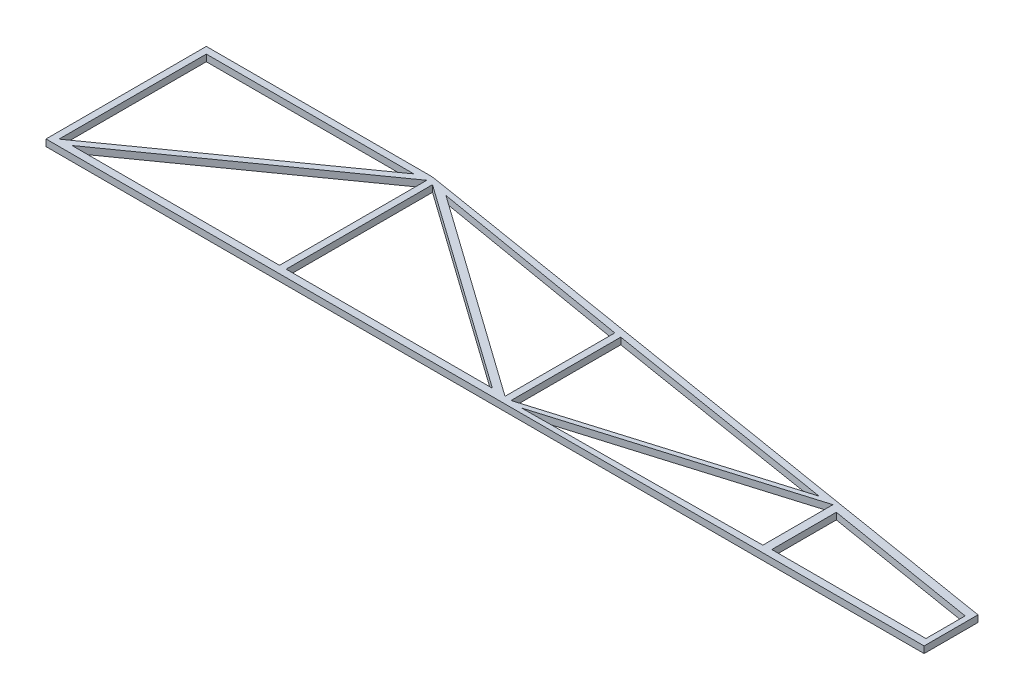
ISO-10303-21;
HEADER;
FILE_DESCRIPTION(('STEP AP214'),'2;1');
FILE_NAME('part.step','',(''),(''),'','','');
FILE_SCHEMA(('AUTOMOTIVE_DESIGN { 1 0 10303 214 1 1 1 1 }'));
ENDSEC;
DATA;
#1=APPLICATION_CONTEXT('core data for automotive mechanical design processes');
#2=APPLICATION_PROTOCOL_DEFINITION('international standard','automotive_design',2000,#1);
#3=PRODUCT_CONTEXT('',#1,'mechanical');
#4=PRODUCT('Part','Part','',(#3));
#5=PRODUCT_RELATED_PRODUCT_CATEGORY('part','',(#4));
#6=PRODUCT_DEFINITION_FORMATION('','',#4);
#7=PRODUCT_DEFINITION_CONTEXT('part definition',#1,'design');
#8=PRODUCT_DEFINITION('design','',#6,#7);
#9=PRODUCT_DEFINITION_SHAPE('','',#8);
#10=(LENGTH_UNIT() NAMED_UNIT(*) SI_UNIT(.MILLI.,.METRE.));
#11=(NAMED_UNIT(*) PLANE_ANGLE_UNIT() SI_UNIT($,.RADIAN.));
#12=(NAMED_UNIT(*) SI_UNIT($,.STERADIAN.) SOLID_ANGLE_UNIT());
#13=UNCERTAINTY_MEASURE_WITH_UNIT(LENGTH_MEASURE(1.E-05),#10,'distance_accuracy_value','');
#14=(GEOMETRIC_REPRESENTATION_CONTEXT(3) GLOBAL_UNCERTAINTY_ASSIGNED_CONTEXT((#13)) GLOBAL_UNIT_ASSIGNED_CONTEXT((#10,
#11,#12)) REPRESENTATION_CONTEXT('',''));
#15=CARTESIAN_POINT('',(0.,0.,0.));
#16=DIRECTION('',(0.,0.,1.));
#17=DIRECTION('',(1.,0.,0.));
#18=AXIS2_PLACEMENT_3D('',#15,#16,#17);
#19=CARTESIAN_POINT('',(0.,-6.35,0.));
#20=DIRECTION('',(0.,-1.,0.));
#21=DIRECTION('',(0.,0.,-1.));
#22=AXIS2_PLACEMENT_3D('',#19,#20,#21);
#23=PLANE('',#22);
#24=DIRECTION('',(0.,0.,-1.));
#25=VECTOR('',#24,1.);
#26=CARTESIAN_POINT('',(161.624236277358,-6.35,134.776122622587));
#27=LINE('',#26,#25);
#28=CARTESIAN_POINT('',(161.624236277358,-6.35,135.411122622587));
#29=VERTEX_POINT('',#28);
#30=CARTESIAN_POINT('',(161.624236277358,-6.35,-5.81236784555289));
#31=VERTEX_POINT('',#30);
#32=EDGE_CURVE('E302',#29,#31,#27,.T.);
#33=ORIENTED_EDGE('',*,*,#32,.T.);
#34=DIRECTION('',(-0.815532011604098,0.,0.578711964667202));
#35=VECTOR('',#34,1.);
#36=CARTESIAN_POINT('',(161.624236277358,-6.35,-5.81236784555289));
#37=LINE('',#36,#35);
#38=CARTESIAN_POINT('',(-37.3906179143402,-6.35,135.411122622587));
#39=VERTEX_POINT('',#38);
#40=EDGE_CURVE('E301',#31,#39,#37,.T.);
#41=ORIENTED_EDGE('',*,*,#40,.T.);
#42=DIRECTION('',(1.,0.,0.));
#43=VECTOR('',#42,1.);
#44=CARTESIAN_POINT('',(0.,-6.35,135.411122622587));
#45=LINE('',#44,#43);
#46=EDGE_CURVE('E307',#39,#29,#45,.T.);
#47=ORIENTED_EDGE('',*,*,#46,.T.);
#48=EDGE_LOOP('',(#33,#41,#47));
#49=FACE_BOUND('',#48,.T.);
#50=DIRECTION('',(1.,0.,0.));
#51=VECTOR('',#50,1.);
#52=CARTESIAN_POINT('',(-54.2757637226416,-6.35,-11.2738773774126));
#53=LINE('',#52,#51);
#54=CARTESIAN_POINT('',(-54.2757637226416,-6.35,-11.2738773774126));
#55=VERTEX_POINT('',#54);
#56=CARTESIAN_POINT('',(159.564403118567,-6.35,-11.2738773774126));
#57=VERTEX_POINT('',#56);
#58=EDGE_CURVE('E314',#55,#57,#53,.T.);
#59=ORIENTED_EDGE('',*,*,#58,.T.);
#60=CARTESIAN_POINT('',(159.564403118567,-6.35,14.1261226225874));
#61=DIRECTION('',(0.,-1.,0.));
#62=DIRECTION('',(0.,0.,-1.));
#63=AXIS2_PLACEMENT_3D('',#60,#61,#62);
#64=CIRCLE('',#63,25.4);
#65=CARTESIAN_POINT('',(163.657153350682,-6.35,-10.9419725491149));
#66=VERTEX_POINT('',#65);
#67=EDGE_CURVE('E349',#57,#66,#64,.T.);
#68=ORIENTED_EDGE('',*,*,#67,.T.);
#69=DIRECTION('',(0.986932880775682,0.,0.161131898902152));
#70=VECTOR('',#69,1.);
#71=CARTESIAN_POINT('',(161.624236277358,-6.35,-11.2738773774126));
#72=LINE('',#71,#70);
#73=CARTESIAN_POINT('',(783.924236277358,-6.35,90.3261226225874));
#74=VERTEX_POINT('',#73);
#75=EDGE_CURVE('E317',#66,#74,#72,.T.);
#76=ORIENTED_EDGE('',*,*,#75,.T.);
#77=DIRECTION('',(0.,0.,1.));
#78=VECTOR('',#77,1.);
#79=CARTESIAN_POINT('',(783.924236277358,-6.35,141.126122622587));
#80=LINE('',#79,#78);
#81=CARTESIAN_POINT('',(783.924236277358,-6.35,141.761122622587));
#82=VERTEX_POINT('',#81);
#83=EDGE_CURVE('E320',#74,#82,#80,.T.);
#84=ORIENTED_EDGE('',*,*,#83,.T.);
#85=DIRECTION('',(-1.,0.,0.));
#86=VECTOR('',#85,1.);
#87=CARTESIAN_POINT('',(-54.2757637226416,-6.35,141.761122622587));
#88=LINE('',#87,#86);
#89=CARTESIAN_POINT('',(-54.2757637226416,-6.35,141.761122622587));
#90=VERTEX_POINT('',#89);
#91=EDGE_CURVE('E322',#82,#90,#88,.T.);
#92=ORIENTED_EDGE('',*,*,#91,.T.);
#93=DIRECTION('',(0.,0.,-1.));
#94=VECTOR('',#93,1.);
#95=CARTESIAN_POINT('',(-54.2757637226416,-6.35,-11.2738773774126));
#96=LINE('',#95,#94);
#97=EDGE_CURVE('E318',#90,#55,#96,.T.);
#98=ORIENTED_EDGE('',*,*,#97,.T.);
#99=EDGE_LOOP('',(#59,#68,#76,#84,#92,#98));
#100=FACE_BOUND('',#99,.T.);
#101=DIRECTION('',(0.,0.,-1.));
#102=VECTOR('',#101,1.);
#103=CARTESIAN_POINT('',(-47.9257637226416,-6.35,135.677412945168));
#104=LINE('',#103,#102);
#105=CARTESIAN_POINT('',(-47.9257637226416,-6.35,135.677412945168));
#106=VERTEX_POINT('',#105);
#107=CARTESIAN_POINT('',(-47.9257637226416,-6.35,-4.92387737741257));
#108=VERTEX_POINT('',#107);
#109=EDGE_CURVE('E283',#106,#108,#104,.T.);
#110=ORIENTED_EDGE('',*,*,#109,.F.);
#111=DIRECTION('',(-0.815507144735218,0.,0.578747005941122));
#112=VECTOR('',#111,1.);
#113=CARTESIAN_POINT('',(150.194236277358,-6.35,-4.92387737741258));
#114=LINE('',#113,#112);
#115=CARTESIAN_POINT('',(150.194236277358,-6.35,-4.92387737741259));
#116=VERTEX_POINT('',#115);
#117=EDGE_CURVE('E287',#116,#106,#114,.T.);
#118=ORIENTED_EDGE('',*,*,#117,.F.);
#119=DIRECTION('',(1.,0.,0.));
#120=VECTOR('',#119,1.);
#121=CARTESIAN_POINT('',(-47.9257637226416,-6.35,-4.92387737741257));
#122=LINE('',#121,#120);
#123=EDGE_CURVE('E284',#108,#116,#122,.T.);
#124=ORIENTED_EDGE('',*,*,#123,.F.);
#125=EDGE_LOOP('',(#110,#118,#124));
#126=FACE_BOUND('',#125,.T.);
#127=DIRECTION('',(0.,0.,1.));
#128=VECTOR('',#127,1.);
#129=CARTESIAN_POINT('',(377.524236277358,-6.35,135.411122622587));
#130=LINE('',#129,#128);
#131=CARTESIAN_POINT('',(377.524236277358,-6.35,30.6361226225874));
#132=VERTEX_POINT('',#131);
#133=CARTESIAN_POINT('',(377.524236277358,-6.35,135.411122622587));
#134=VERTEX_POINT('',#133);
#135=EDGE_CURVE('E269',#132,#134,#130,.T.);
#136=ORIENTED_EDGE('',*,*,#135,.F.);
#137=DIRECTION('',(0.98584155790816,0.,0.167679523798265));
#138=VECTOR('',#137,1.);
#139=CARTESIAN_POINT('',(183.325676014133,-6.35,-2.39466396379012));
#140=LINE('',#139,#138);
#141=CARTESIAN_POINT('',(183.325676014133,-6.35,-2.39466396379012));
#142=VERTEX_POINT('',#141);
#143=EDGE_CURVE('E268',#142,#132,#140,.T.);
#144=ORIENTED_EDGE('',*,*,#143,.F.);
#145=DIRECTION('',(-0.815532011604098,0.,-0.578711964667202));
#146=VECTOR('',#145,1.);
#147=CARTESIAN_POINT('',(377.524236277358,-6.35,135.411122622587));
#148=LINE('',#147,#146);
#149=EDGE_CURVE('E265',#134,#142,#148,.T.);
#150=ORIENTED_EDGE('',*,*,#149,.F.);
#151=EDGE_LOOP('',(#136,#144,#150));
#152=FACE_BOUND('',#151,.T.);
#153=DIRECTION('',(0.,0.,1.));
#154=VECTOR('',#153,1.);
#155=CARTESIAN_POINT('',(167.974236277358,-6.35,134.776122622587));
#156=LINE('',#155,#154);
#157=CARTESIAN_POINT('',(167.974236277358,-6.35,-4.92387737741257));
#158=VERTEX_POINT('',#157);
#159=CARTESIAN_POINT('',(167.974236277358,-6.35,135.411122622587));
#160=VERTEX_POINT('',#159);
#161=EDGE_CURVE('E256',#158,#160,#156,.T.);
#162=ORIENTED_EDGE('',*,*,#161,.T.);
#163=DIRECTION('',(1.,0.,0.));
#164=VECTOR('',#163,1.);
#165=CARTESIAN_POINT('',(0.,-6.35,135.411122622587));
#166=LINE('',#165,#164);
#167=CARTESIAN_POINT('',(365.719009004631,-6.35,135.411122622587));
#168=VERTEX_POINT('',#167);
#169=EDGE_CURVE('E257',#160,#168,#166,.T.);
#170=ORIENTED_EDGE('',*,*,#169,.T.);
#171=DIRECTION('',(-0.815507144735217,0.,-0.578747005941122));
#172=VECTOR('',#171,1.);
#173=CARTESIAN_POINT('',(364.824236277358,-6.35,134.776122622587));
#174=LINE('',#173,#172);
#175=EDGE_CURVE('E252',#168,#158,#174,.T.);
#176=ORIENTED_EDGE('',*,*,#175,.T.);
#177=EDGE_LOOP('',(#162,#170,#176));
#178=FACE_BOUND('',#177,.T.);
#179=DIRECTION('',(-1.,0.,0.));
#180=VECTOR('',#179,1.);
#181=CARTESIAN_POINT('',(0.,-6.35,135.411122622587));
#182=LINE('',#181,#180);
#183=CARTESIAN_POINT('',(778.67236537485,-6.35,135.411122622587));
#184=VERTEX_POINT('',#183);
#185=CARTESIAN_POINT('',(631.524236277358,-6.35,135.411122622587));
#186=VERTEX_POINT('',#185);
#187=EDGE_CURVE('E241',#184,#186,#182,.T.);
#188=ORIENTED_EDGE('',*,*,#187,.F.);
#189=DIRECTION('',(0.,0.,1.));
#190=VECTOR('',#189,1.);
#191=CARTESIAN_POINT('',(778.67236537485,-6.35,134.776122622587));
#192=LINE('',#191,#190);
#193=CARTESIAN_POINT('',(778.67236537485,-6.35,97.3493576564751));
#194=VERTEX_POINT('',#193);
#195=EDGE_CURVE('E247',#194,#184,#192,.T.);
#196=ORIENTED_EDGE('',*,*,#195,.F.);
#197=DIRECTION('',(0.986778811606319,0.,0.16207275207394));
#198=VECTOR('',#197,1.);
#199=CARTESIAN_POINT('',(631.422680754228,-6.35,73.1644427112147));
#200=LINE('',#199,#198);
#201=CARTESIAN_POINT('',(631.524236277358,-6.35,73.1811226225874));
#202=VERTEX_POINT('',#201);
#203=EDGE_CURVE('E246',#202,#194,#200,.T.);
#204=ORIENTED_EDGE('',*,*,#203,.F.);
#205=DIRECTION('',(0.,0.,-1.));
#206=VECTOR('',#205,1.);
#207=CARTESIAN_POINT('',(631.524236277358,-6.35,134.776122622587));
#208=LINE('',#207,#206);
#209=EDGE_CURVE('E242',#186,#202,#208,.T.);
#210=ORIENTED_EDGE('',*,*,#209,.F.);
#211=EDGE_LOOP('',(#188,#196,#204,#210));
#212=FACE_BOUND('',#211,.T.);
#213=DIRECTION('',(0.,0.,-1.));
#214=VECTOR('',#213,1.);
#215=CARTESIAN_POINT('',(383.874236277358,-6.35,136.046122622587));
#216=LINE('',#215,#214);
#217=CARTESIAN_POINT('',(383.874236277358,-6.35,136.046122622587));
#218=VERTEX_POINT('',#217);
#219=CARTESIAN_POINT('',(383.874236277358,-6.35,31.2711226225874));
#220=VERTEX_POINT('',#219);
#221=EDGE_CURVE('E205',#218,#220,#216,.T.);
#222=ORIENTED_EDGE('',*,*,#221,.F.);
#223=DIRECTION('',(-0.957684417737405,0.,0.287820353732961));
#224=VECTOR('',#223,1.);
#225=CARTESIAN_POINT('',(610.04305664974,-6.35,68.0738462888665));
#226=LINE('',#225,#224);
#227=CARTESIAN_POINT('',(610.04305664974,-6.35,68.0738462888664));
#228=VERTEX_POINT('',#227);
#229=EDGE_CURVE('E228',#228,#218,#226,.T.);
#230=ORIENTED_EDGE('',*,*,#229,.F.);
#231=DIRECTION('',(0.987017964959984,0.,0.160609890250421));
#232=VECTOR('',#231,1.);
#233=CARTESIAN_POINT('',(383.874236277358,-6.35,31.2711226225874));
#234=LINE('',#233,#232);
#235=EDGE_CURVE('E225',#220,#228,#234,.T.);
#236=ORIENTED_EDGE('',*,*,#235,.F.);
#237=EDGE_LOOP('',(#222,#230,#236));
#238=FACE_BOUND('',#237,.T.);
#239=DIRECTION('',(-0.957671901939607,0.,0.28786199512158));
#240=VECTOR('',#239,1.);
#241=CARTESIAN_POINT('',(395.04542805939,-6.35,137.199185753966));
#242=LINE('',#241,#240);
#243=CARTESIAN_POINT('',(623.638435017691,-6.35,68.4875122459676));
#244=VERTEX_POINT('',#243);
#245=CARTESIAN_POINT('',(395.04542805939,-6.35,137.199185753966));
#246=VERTEX_POINT('',#245);
#247=EDGE_CURVE('E213',#244,#246,#242,.T.);
#248=ORIENTED_EDGE('',*,*,#247,.T.);
#249=DIRECTION('',(0.999969409266412,0.,-0.00782179847497131));
#250=VECTOR('',#249,1.);
#251=CARTESIAN_POINT('',(623.638435017691,-6.35,135.411122622587));
#252=LINE('',#251,#250);
#253=CARTESIAN_POINT('',(623.638435017691,-6.35,135.411122622587));
#254=VERTEX_POINT('',#253);
#255=EDGE_CURVE('E31',#246,#254,#252,.T.);
#256=ORIENTED_EDGE('',*,*,#255,.T.);
#257=DIRECTION('',(0.,0.,-1.));
#258=VECTOR('',#257,1.);
#259=CARTESIAN_POINT('',(623.638435017691,-6.35,135.411122622587));
#260=LINE('',#259,#258);
#261=EDGE_CURVE('E208',#254,#244,#260,.T.);
#262=ORIENTED_EDGE('',*,*,#261,.T.);
#263=EDGE_LOOP('',(#248,#256,#262));
#264=FACE_BOUND('',#263,.T.);
#265=ADVANCED_FACE('F16',(#49,#100,#126,#152,#178,#212,#238,#264),#23,.T.);
#266=CARTESIAN_POINT('',(0.,0.,0.));
#267=DIRECTION('',(0.,-1.,0.));
#268=DIRECTION('',(0.,0.,-1.));
#269=AXIS2_PLACEMENT_3D('',#266,#267,#268);
#270=PLANE('',#269);
#271=DIRECTION('',(-0.815532011604098,0.,0.578711964667202));
#272=VECTOR('',#271,1.);
#273=CARTESIAN_POINT('',(51.3859807858336,0.,72.4141107098411));
#274=LINE('',#273,#272);
#275=CARTESIAN_POINT('',(161.624236277358,0.,-5.81236784555289));
#276=VERTEX_POINT('',#275);
#277=CARTESIAN_POINT('',(-36.4957637226417,0.,134.776122622587));
#278=VERTEX_POINT('',#277);
#279=EDGE_CURVE('E360',#276,#278,#274,.T.);
#280=ORIENTED_EDGE('',*,*,#279,.F.);
#281=DIRECTION('',(0.,0.,-1.));
#282=VECTOR('',#281,1.);
#283=CARTESIAN_POINT('',(161.624236277358,0.,0.));
#284=LINE('',#283,#282);
#285=CARTESIAN_POINT('',(161.624236277358,0.,134.776122622587));
#286=VERTEX_POINT('',#285);
#287=EDGE_CURVE('E351',#286,#276,#284,.T.);
#288=ORIENTED_EDGE('',*,*,#287,.F.);
#289=DIRECTION('',(1.,0.,0.));
#290=VECTOR('',#289,1.);
#291=CARTESIAN_POINT('',(0.,0.,134.776122622587));
#292=LINE('',#291,#290);
#293=EDGE_CURVE('E359',#278,#286,#292,.T.);
#294=ORIENTED_EDGE('',*,*,#293,.F.);
#295=EDGE_LOOP('',(#280,#288,#294));
#296=FACE_BOUND('',#295,.T.);
#297=DIRECTION('',(0.986932880775682,0.,0.161131898902152));
#298=VECTOR('',#297,1.);
#299=CARTESIAN_POINT('',(161.624236277358,0.,-11.2738773774126));
#300=LINE('',#299,#298);
#301=CARTESIAN_POINT('',(163.657153350682,0.,-10.9419725491149));
#302=VERTEX_POINT('',#301);
#303=CARTESIAN_POINT('',(783.924236277358,0.,90.3261226225874));
#304=VERTEX_POINT('',#303);
#305=EDGE_CURVE('E330',#302,#304,#300,.T.);
#306=ORIENTED_EDGE('',*,*,#305,.F.);
#307=CARTESIAN_POINT('',(159.564403118567,0.,14.1261226225874));
#308=DIRECTION('',(0.,-1.,0.));
#309=DIRECTION('',(0.,0.,-1.));
#310=AXIS2_PLACEMENT_3D('',#307,#308,#309);
#311=CIRCLE('',#310,25.4);
#312=CARTESIAN_POINT('',(159.564403118567,0.,-11.2738773774126));
#313=VERTEX_POINT('',#312);
#314=EDGE_CURVE('E355',#302,#313,#311,.F.);
#315=ORIENTED_EDGE('',*,*,#314,.T.);
#316=DIRECTION('',(1.,0.,0.));
#317=VECTOR('',#316,1.);
#318=CARTESIAN_POINT('',(-54.2757637226416,0.,-11.2738773774126));
#319=LINE('',#318,#317);
#320=CARTESIAN_POINT('',(-54.2757637226416,0.,-11.2738773774126));
#321=VERTEX_POINT('',#320);
#322=EDGE_CURVE('E326',#321,#313,#319,.T.);
#323=ORIENTED_EDGE('',*,*,#322,.F.);
#324=DIRECTION('',(0.,0.,-1.));
#325=VECTOR('',#324,1.);
#326=CARTESIAN_POINT('',(-54.2757637226416,0.,-11.2738773774126));
#327=LINE('',#326,#325);
#328=CARTESIAN_POINT('',(-54.2757637226416,0.,141.761122622587));
#329=VERTEX_POINT('',#328);
#330=EDGE_CURVE('E331',#329,#321,#327,.T.);
#331=ORIENTED_EDGE('',*,*,#330,.F.);
#332=DIRECTION('',(-1.,0.,0.));
#333=VECTOR('',#332,1.);
#334=CARTESIAN_POINT('',(-54.2757637226416,0.,141.761122622587));
#335=LINE('',#334,#333);
#336=CARTESIAN_POINT('',(783.924236277358,0.,141.761122622587));
#337=VERTEX_POINT('',#336);
#338=EDGE_CURVE('E325',#337,#329,#335,.T.);
#339=ORIENTED_EDGE('',*,*,#338,.F.);
#340=DIRECTION('',(0.,0.,1.));
#341=VECTOR('',#340,1.);
#342=CARTESIAN_POINT('',(783.924236277358,0.,141.126122622587));
#343=LINE('',#342,#341);
#344=EDGE_CURVE('E334',#304,#337,#343,.T.);
#345=ORIENTED_EDGE('',*,*,#344,.F.);
#346=EDGE_LOOP('',(#306,#315,#323,#331,#339,#345));
#347=FACE_BOUND('',#346,.T.);
#348=DIRECTION('',(-0.815507144735218,0.,0.578747005941122));
#349=VECTOR('',#348,1.);
#350=CARTESIAN_POINT('',(47.9833397832845,0.,67.6128878764463));
#351=LINE('',#350,#349);
#352=CARTESIAN_POINT('',(150.194236277358,0.,-4.92387737741258));
#353=VERTEX_POINT('',#352);
#354=CARTESIAN_POINT('',(-47.9257637226416,0.,135.677412945168));
#355=VERTEX_POINT('',#354);
#356=EDGE_CURVE('E362',#353,#355,#351,.T.);
#357=ORIENTED_EDGE('',*,*,#356,.T.);
#358=DIRECTION('',(0.,0.,-1.));
#359=VECTOR('',#358,1.);
#360=CARTESIAN_POINT('',(-47.9257637226416,0.,0.));
#361=LINE('',#360,#359);
#362=CARTESIAN_POINT('',(-47.9257637226416,0.,-4.92387737741257));
#363=VERTEX_POINT('',#362);
#364=EDGE_CURVE('E368',#355,#363,#361,.T.);
#365=ORIENTED_EDGE('',*,*,#364,.T.);
#366=DIRECTION('',(1.,0.,0.));
#367=VECTOR('',#366,1.);
#368=CARTESIAN_POINT('',(0.,0.,-4.92387737741257));
#369=LINE('',#368,#367);
#370=EDGE_CURVE('E365',#363,#353,#369,.T.);
#371=ORIENTED_EDGE('',*,*,#370,.T.);
#372=EDGE_LOOP('',(#357,#365,#371));
#373=FACE_BOUND('',#372,.T.);
#374=DIRECTION('',(0.98584155790816,0.,0.167679523798265));
#375=VECTOR('',#374,1.);
#376=CARTESIAN_POINT('',(5.55031318609897,0.,-32.632066660954));
#377=LINE('',#376,#375);
#378=CARTESIAN_POINT('',(183.325676014133,0.,-2.39466396379012));
#379=VERTEX_POINT('',#378);
#380=CARTESIAN_POINT('',(377.524236277358,0.,30.6361226225874));
#381=VERTEX_POINT('',#380);
#382=EDGE_CURVE('E371',#379,#381,#377,.T.);
#383=ORIENTED_EDGE('',*,*,#382,.T.);
#384=DIRECTION('',(0.,0.,1.));
#385=VECTOR('',#384,1.);
#386=CARTESIAN_POINT('',(377.524236277358,0.,0.));
#387=LINE('',#386,#385);
#388=CARTESIAN_POINT('',(377.524236277358,0.,135.411122622587));
#389=VERTEX_POINT('',#388);
#390=EDGE_CURVE('E377',#381,#389,#387,.T.);
#391=ORIENTED_EDGE('',*,*,#390,.T.);
#392=DIRECTION('',(-0.815532011604098,0.,-0.578711964667202));
#393=VECTOR('',#392,1.);
#394=CARTESIAN_POINT('',(62.5273319478138,0.,-88.1147166759584));
#395=LINE('',#394,#393);
#396=EDGE_CURVE('E374',#389,#379,#395,.T.);
#397=ORIENTED_EDGE('',*,*,#396,.T.);
#398=EDGE_LOOP('',(#383,#391,#397));
#399=FACE_BOUND('',#398,.T.);
#400=DIRECTION('',(1.,0.,0.));
#401=VECTOR('',#400,1.);
#402=CARTESIAN_POINT('',(0.,0.,134.776122622587));
#403=LINE('',#402,#401);
#404=CARTESIAN_POINT('',(167.974236277358,0.,134.776122622587));
#405=VERTEX_POINT('',#404);
#406=CARTESIAN_POINT('',(364.824236277358,0.,134.776122622587));
#407=VERTEX_POINT('',#406);
#408=EDGE_CURVE('E385',#405,#407,#403,.T.);
#409=ORIENTED_EDGE('',*,*,#408,.F.);
#410=DIRECTION('',(0.,0.,1.));
#411=VECTOR('',#410,1.);
#412=CARTESIAN_POINT('',(167.974236277358,0.,0.));
#413=LINE('',#412,#411);
#414=CARTESIAN_POINT('',(167.974236277358,0.,-4.92387737741257));
#415=VERTEX_POINT('',#414);
#416=EDGE_CURVE('E380',#415,#405,#413,.T.);
#417=ORIENTED_EDGE('',*,*,#416,.F.);
#418=DIRECTION('',(-0.815507144735217,0.,-0.578747005941122));
#419=VECTOR('',#418,1.);
#420=CARTESIAN_POINT('',(58.586584587984,0.,-82.5538237376138));
#421=LINE('',#420,#419);
#422=EDGE_CURVE('E382',#407,#415,#421,.T.);
#423=ORIENTED_EDGE('',*,*,#422,.F.);
#424=EDGE_LOOP('',(#409,#417,#423));
#425=FACE_BOUND('',#424,.T.);
#426=DIRECTION('',(0.,0.,1.));
#427=VECTOR('',#426,1.);
#428=CARTESIAN_POINT('',(778.67236537485,0.,0.));
#429=LINE('',#428,#427);
#430=CARTESIAN_POINT('',(778.67236537485,0.,97.3493576564751));
#431=VERTEX_POINT('',#430);
#432=CARTESIAN_POINT('',(778.67236537485,0.,134.776122622587));
#433=VERTEX_POINT('',#432);
#434=EDGE_CURVE('E386',#431,#433,#429,.T.);
#435=ORIENTED_EDGE('',*,*,#434,.T.);
#436=DIRECTION('',(-1.,0.,0.));
#437=VECTOR('',#436,1.);
#438=CARTESIAN_POINT('',(0.,0.,134.776122622587));
#439=LINE('',#438,#437);
#440=CARTESIAN_POINT('',(631.524236277358,0.,134.776122622587));
#441=VERTEX_POINT('',#440);
#442=EDGE_CURVE('E393',#433,#441,#439,.T.);
#443=ORIENTED_EDGE('',*,*,#442,.T.);
#444=DIRECTION('',(0.,0.,-1.));
#445=VECTOR('',#444,1.);
#446=CARTESIAN_POINT('',(631.524236277358,0.,0.));
#447=LINE('',#446,#445);
#448=CARTESIAN_POINT('',(631.524236277358,0.,73.1811226225874));
#449=VERTEX_POINT('',#448);
#450=EDGE_CURVE('E390',#441,#449,#447,.T.);
#451=ORIENTED_EDGE('',*,*,#450,.T.);
#452=DIRECTION('',(0.986778811606319,0.,0.16207275207394));
#453=VECTOR('',#452,1.);
#454=CARTESIAN_POINT('',(4.88475763717289,0.,-29.7408125333452));
#455=LINE('',#454,#453);
#456=EDGE_CURVE('E389',#449,#431,#455,.T.);
#457=ORIENTED_EDGE('',*,*,#456,.T.);
#458=EDGE_LOOP('',(#435,#443,#451,#457));
#459=FACE_BOUND('',#458,.T.);
#460=DIRECTION('',(-0.957684417737405,0.,0.287820353732961));
#461=VECTOR('',#460,1.);
#462=CARTESIAN_POINT('',(69.3002536964221,0.,230.587490598001));
#463=LINE('',#462,#461);
#464=CARTESIAN_POINT('',(610.04305664974,4.44089209850063E-13,68.0738462888665));
#465=VERTEX_POINT('',#464);
#466=CARTESIAN_POINT('',(383.874236277358,0.,136.046122622587));
#467=VERTEX_POINT('',#466);
#468=EDGE_CURVE('E415',#465,#467,#463,.T.);
#469=ORIENTED_EDGE('',*,*,#468,.T.);
#470=DIRECTION('',(0.,0.,-1.));
#471=VECTOR('',#470,1.);
#472=CARTESIAN_POINT('',(383.874236277358,0.,0.));
#473=LINE('',#472,#471);
#474=CARTESIAN_POINT('',(383.874236277358,4.44089209850063E-13,31.2711226225874));
#475=VERTEX_POINT('',#474);
#476=EDGE_CURVE('E439',#467,#475,#473,.T.);
#477=ORIENTED_EDGE('',*,*,#476,.T.);
#478=DIRECTION('',(0.987017964959984,0.,0.160609890250421));
#479=VECTOR('',#478,1.);
#480=CARTESIAN_POINT('',(4.94499207609825,0.,-30.3891373568818));
#481=LINE('',#480,#479);
#482=EDGE_CURVE('E436',#475,#465,#481,.T.);
#483=ORIENTED_EDGE('',*,*,#482,.T.);
#484=EDGE_LOOP('',(#469,#477,#483));
#485=FACE_BOUND('',#484,.T.);
#486=DIRECTION('',(0.999969409266412,0.,-0.00782179847497131));
#487=VECTOR('',#486,1.);
#488=CARTESIAN_POINT('',(1.09728064283291,0.,140.280663037297));
#489=LINE('',#488,#487);
#490=CARTESIAN_POINT('',(395.04542805939,4.44089209850063E-13,137.199185753966));
#491=VERTEX_POINT('',#490);
#492=CARTESIAN_POINT('',(623.638435017691,4.44089209850063E-13,135.411122622587));
#493=VERTEX_POINT('',#492);
#494=EDGE_CURVE('E10',#491,#493,#489,.T.);
#495=ORIENTED_EDGE('',*,*,#494,.F.);
#496=DIRECTION('',(-0.957671901939607,0.,0.28786199512158));
#497=VECTOR('',#496,1.);
#498=CARTESIAN_POINT('',(70.5579602052694,0.,234.735314462822));
#499=LINE('',#498,#497);
#500=CARTESIAN_POINT('',(623.638435017691,0.,68.4875122459676));
#501=VERTEX_POINT('',#500);
#502=EDGE_CURVE('E442',#501,#491,#499,.T.);
#503=ORIENTED_EDGE('',*,*,#502,.F.);
#504=DIRECTION('',(0.,0.,-1.));
#505=VECTOR('',#504,1.);
#506=CARTESIAN_POINT('',(623.638435017691,0.,0.));
#507=LINE('',#506,#505);
#508=EDGE_CURVE('E24',#493,#501,#507,.T.);
#509=ORIENTED_EDGE('',*,*,#508,.F.);
#510=EDGE_LOOP('',(#495,#503,#509));
#511=FACE_BOUND('',#510,.T.);
#512=ADVANCED_FACE('F445',(#296,#347,#373,#399,#425,#459,#485,#511),#270,.F.);
#513=CARTESIAN_POINT('',(-54.2757637226416,-6.35,-11.2738773774126));
#514=DIRECTION('',(1.,0.,0.));
#515=DIRECTION('',(0.,0.,-1.));
#516=AXIS2_PLACEMENT_3D('',#513,#514,#515);
#517=PLANE('',#516);
#518=ORIENTED_EDGE('',*,*,#330,.T.);
#519=DIRECTION('',(0.,1.,0.));
#520=VECTOR('',#519,1.);
#521=CARTESIAN_POINT('',(-54.2757637226416,-6.35,-11.2738773774126));
#522=LINE('',#521,#520);
#523=EDGE_CURVE('E344',#55,#321,#522,.T.);
#524=ORIENTED_EDGE('',*,*,#523,.F.);
#525=ORIENTED_EDGE('',*,*,#97,.F.);
#526=DIRECTION('',(0.,1.,0.));
#527=VECTOR('',#526,1.);
#528=CARTESIAN_POINT('',(-54.2757637226416,-6.35,141.761122622587));
#529=LINE('',#528,#527);
#530=EDGE_CURVE('E398',#90,#329,#529,.T.);
#531=ORIENTED_EDGE('',*,*,#530,.T.);
#532=EDGE_LOOP('',(#518,#524,#525,#531));
#533=FACE_BOUND('',#532,.T.);
#534=ADVANCED_FACE('F465',(#533),#517,.F.);
#535=CARTESIAN_POINT('',(-54.2757637226416,-6.35,-11.2738773774126));
#536=DIRECTION('',(0.,0.,1.));
#537=DIRECTION('',(1.,0.,0.));
#538=AXIS2_PLACEMENT_3D('',#535,#536,#537);
#539=PLANE('',#538);
#540=ORIENTED_EDGE('',*,*,#322,.T.);
#541=DIRECTION('',(0.,-1.,0.));
#542=VECTOR('',#541,1.);
#543=CARTESIAN_POINT('',(159.564403118567,-6.35,-11.2738773774126));
#544=LINE('',#543,#542);
#545=EDGE_CURVE('E352',#313,#57,#544,.T.);
#546=ORIENTED_EDGE('',*,*,#545,.T.);
#547=ORIENTED_EDGE('',*,*,#58,.F.);
#548=ORIENTED_EDGE('',*,*,#523,.T.);
#549=EDGE_LOOP('',(#540,#546,#547,#548));
#550=FACE_BOUND('',#549,.T.);
#551=ADVANCED_FACE('F481',(#550),#539,.F.);
#552=CARTESIAN_POINT('',(161.624236277358,-6.35,-11.2738773774126));
#553=DIRECTION('',(-0.161131898902152,0.,0.986932880775682));
#554=DIRECTION('',(0.986932880775682,0.,0.161131898902152));
#555=AXIS2_PLACEMENT_3D('',#552,#553,#554);
#556=PLANE('',#555);
#557=ORIENTED_EDGE('',*,*,#75,.F.);
#558=DIRECTION('',(0.,-1.,0.));
#559=VECTOR('',#558,1.);
#560=CARTESIAN_POINT('',(163.657153350682,-6.35,-10.9419725491149));
#561=LINE('',#560,#559);
#562=EDGE_CURVE('E348',#66,#302,#561,.F.);
#563=ORIENTED_EDGE('',*,*,#562,.T.);
#564=ORIENTED_EDGE('',*,*,#305,.T.);
#565=DIRECTION('',(0.,1.,0.));
#566=VECTOR('',#565,1.);
#567=CARTESIAN_POINT('',(783.924236277358,-6.35,90.3261226225874));
#568=LINE('',#567,#566);
#569=EDGE_CURVE('E341',#74,#304,#568,.T.);
#570=ORIENTED_EDGE('',*,*,#569,.F.);
#571=EDGE_LOOP('',(#557,#563,#564,#570));
#572=FACE_BOUND('',#571,.T.);
#573=ADVANCED_FACE('F477',(#572),#556,.F.);
#574=CARTESIAN_POINT('',(783.924236277358,-6.35,141.126122622587));
#575=DIRECTION('',(-1.,0.,0.));
#576=DIRECTION('',(0.,0.,1.));
#577=AXIS2_PLACEMENT_3D('',#574,#575,#576);
#578=PLANE('',#577);
#579=ORIENTED_EDGE('',*,*,#344,.T.);
#580=DIRECTION('',(0.,1.,0.));
#581=VECTOR('',#580,1.);
#582=CARTESIAN_POINT('',(783.924236277358,-6.35,141.761122622587));
#583=LINE('',#582,#581);
#584=EDGE_CURVE('E345',#82,#337,#583,.T.);
#585=ORIENTED_EDGE('',*,*,#584,.F.);
#586=ORIENTED_EDGE('',*,*,#83,.F.);
#587=ORIENTED_EDGE('',*,*,#569,.T.);
#588=EDGE_LOOP('',(#579,#585,#586,#587));
#589=FACE_BOUND('',#588,.T.);
#590=ADVANCED_FACE('F473',(#589),#578,.F.);
#591=CARTESIAN_POINT('',(-54.2757637226416,-6.35,141.761122622587));
#592=DIRECTION('',(0.,0.,-1.));
#593=DIRECTION('',(-1.,0.,0.));
#594=AXIS2_PLACEMENT_3D('',#591,#592,#593);
#595=PLANE('',#594);
#596=ORIENTED_EDGE('',*,*,#338,.T.);
#597=ORIENTED_EDGE('',*,*,#530,.F.);
#598=ORIENTED_EDGE('',*,*,#91,.F.);
#599=ORIENTED_EDGE('',*,*,#584,.T.);
#600=EDGE_LOOP('',(#596,#597,#598,#599));
#601=FACE_BOUND('',#600,.T.);
#602=ADVANCED_FACE('F476',(#601),#595,.F.);
#603=CARTESIAN_POINT('',(159.564403118567,-6.35,14.1261226225874));
#604=DIRECTION('',(0.,-1.,0.));
#605=DIRECTION('',(0.,0.,-1.));
#606=AXIS2_PLACEMENT_3D('',#603,#604,#605);
#607=CYLINDRICAL_SURFACE('',#606,25.4);
#608=ORIENTED_EDGE('',*,*,#67,.F.);
#609=ORIENTED_EDGE('',*,*,#545,.F.);
#610=ORIENTED_EDGE('',*,*,#314,.F.);
#611=ORIENTED_EDGE('',*,*,#562,.F.);
#612=EDGE_LOOP('',(#608,#609,#610,#611));
#613=FACE_BOUND('',#612,.T.);
#614=ADVANCED_FACE('F489',(#613),#607,.T.);
#615=CARTESIAN_POINT('',(161.624236277358,24.0016084650391,-5.81236784555289));
#616=DIRECTION('',(0.578711964667202,0.,0.815532011604098));
#617=DIRECTION('',(0.815532011604098,0.,-0.578711964667202));
#618=AXIS2_PLACEMENT_3D('',#615,#616,#617);
#619=PLANE('',#618);
#620=ORIENTED_EDGE('',*,*,#279,.T.);
#621=DIRECTION('',(-0.138863999599686,-0.98539673349939,0.0985396733499306));
#622=VECTOR('',#621,1.);
#623=CARTESIAN_POINT('',(-32.9523875352112,25.1442514310342,132.261697479484));
#624=LINE('',#623,#622);
#625=EDGE_CURVE('E340',#278,#39,#624,.T.);
#626=ORIENTED_EDGE('',*,*,#625,.T.);
#627=ORIENTED_EDGE('',*,*,#40,.F.);
#628=DIRECTION('',(0.,-1.,0.));
#629=VECTOR('',#628,1.);
#630=CARTESIAN_POINT('',(161.624236277358,24.0016084650391,-5.81236784555289));
#631=LINE('',#630,#629);
#632=EDGE_CURVE('E306',#276,#31,#631,.T.);
#633=ORIENTED_EDGE('',*,*,#632,.F.);
#634=EDGE_LOOP('',(#620,#626,#627,#633));
#635=FACE_BOUND('',#634,.T.);
#636=ADVANCED_FACE('F470',(#635),#619,.T.);
#637=CARTESIAN_POINT('',(-36.4957637226417,25.6386468522686,132.212257937361));
#638=DIRECTION('',(0.,-0.0995037190209906,-0.99503719020999));
#639=DIRECTION('',(-1.,0.,0.));
#640=AXIS2_PLACEMENT_3D('',#637,#638,#639);
#641=PLANE('',#640);
#642=ORIENTED_EDGE('',*,*,#293,.T.);
#643=DIRECTION('',(0.,-0.99503719020999,0.0995037190209906));
#644=VECTOR('',#643,1.);
#645=CARTESIAN_POINT('',(161.624236277358,25.6386468522686,132.212257937361));
#646=LINE('',#645,#644);
#647=EDGE_CURVE('E313',#286,#29,#646,.T.);
#648=ORIENTED_EDGE('',*,*,#647,.T.);
#649=ORIENTED_EDGE('',*,*,#46,.F.);
#650=ORIENTED_EDGE('',*,*,#625,.F.);
#651=EDGE_LOOP('',(#642,#648,#649,#650));
#652=FACE_BOUND('',#651,.T.);
#653=ADVANCED_FACE('F496',(#652),#641,.T.);
#654=CARTESIAN_POINT('',(161.624236277358,24.0016084650391,134.776122622587));
#655=DIRECTION('',(-1.,0.,0.));
#656=DIRECTION('',(0.,0.,1.));
#657=AXIS2_PLACEMENT_3D('',#654,#655,#656);
#658=PLANE('',#657);
#659=ORIENTED_EDGE('',*,*,#287,.T.);
#660=ORIENTED_EDGE('',*,*,#632,.T.);
#661=ORIENTED_EDGE('',*,*,#32,.F.);
#662=ORIENTED_EDGE('',*,*,#647,.F.);
#663=EDGE_LOOP('',(#659,#660,#661,#662));
#664=FACE_BOUND('',#663,.T.);
#665=ADVANCED_FACE('F499',(#664),#658,.T.);
#666=CARTESIAN_POINT('',(-47.9257637226416,24.0016084650391,135.677412945168));
#667=DIRECTION('',(-1.,0.,0.));
#668=DIRECTION('',(0.,0.,1.));
#669=AXIS2_PLACEMENT_3D('',#666,#667,#668);
#670=PLANE('',#669);
#671=DIRECTION('',(0.,-1.,0.));
#672=VECTOR('',#671,1.);
#673=CARTESIAN_POINT('',(-47.9257637226416,24.0016084650391,135.677412945168));
#674=LINE('',#673,#672);
#675=EDGE_CURVE('E291',#355,#106,#674,.T.);
#676=ORIENTED_EDGE('',*,*,#675,.T.);
#677=ORIENTED_EDGE('',*,*,#109,.T.);
#678=DIRECTION('',(0.,-1.,0.));
#679=VECTOR('',#678,1.);
#680=CARTESIAN_POINT('',(-47.9257637226416,24.0016084650391,-4.92387737741257));
#681=LINE('',#680,#679);
#682=EDGE_CURVE('E299',#363,#108,#681,.T.);
#683=ORIENTED_EDGE('',*,*,#682,.F.);
#684=ORIENTED_EDGE('',*,*,#364,.F.);
#685=EDGE_LOOP('',(#676,#677,#683,#684));
#686=FACE_BOUND('',#685,.T.);
#687=ADVANCED_FACE('F569',(#686),#670,.F.);
#688=CARTESIAN_POINT('',(-47.9257637226416,24.0016084650391,-4.92387737741257));
#689=DIRECTION('',(0.,0.,-1.));
#690=DIRECTION('',(-1.,0.,0.));
#691=AXIS2_PLACEMENT_3D('',#688,#689,#690);
#692=PLANE('',#691);
#693=ORIENTED_EDGE('',*,*,#682,.T.);
#694=ORIENTED_EDGE('',*,*,#123,.T.);
#695=DIRECTION('',(0.,-1.,0.));
#696=VECTOR('',#695,1.);
#697=CARTESIAN_POINT('',(150.194236277358,24.0016084650391,-4.92387737741258));
#698=LINE('',#697,#696);
#699=EDGE_CURVE('E296',#353,#116,#698,.T.);
#700=ORIENTED_EDGE('',*,*,#699,.F.);
#701=ORIENTED_EDGE('',*,*,#370,.F.);
#702=EDGE_LOOP('',(#693,#694,#700,#701));
#703=FACE_BOUND('',#702,.T.);
#704=ADVANCED_FACE('F565',(#703),#692,.F.);
#705=CARTESIAN_POINT('',(150.194236277358,24.0016084650391,-4.92387737741258));
#706=DIRECTION('',(0.578747005941122,0.,0.815507144735218));
#707=DIRECTION('',(0.815507144735218,0.,-0.578747005941122));
#708=AXIS2_PLACEMENT_3D('',#705,#706,#707);
#709=PLANE('',#708);
#710=ORIENTED_EDGE('',*,*,#699,.T.);
#711=ORIENTED_EDGE('',*,*,#117,.T.);
#712=ORIENTED_EDGE('',*,*,#675,.F.);
#713=ORIENTED_EDGE('',*,*,#356,.F.);
#714=EDGE_LOOP('',(#710,#711,#712,#713));
#715=FACE_BOUND('',#714,.T.);
#716=ADVANCED_FACE('F561',(#715),#709,.F.);
#717=CARTESIAN_POINT('',(377.524236277358,353.862807358401,135.411122622587));
#718=DIRECTION('',(1.,0.,0.));
#719=DIRECTION('',(0.,0.,-1.));
#720=AXIS2_PLACEMENT_3D('',#717,#718,#719);
#721=PLANE('',#720);
#722=DIRECTION('',(0.,-1.,0.));
#723=VECTOR('',#722,1.);
#724=CARTESIAN_POINT('',(377.524236277358,353.862807358401,30.6361226225874));
#725=LINE('',#724,#723);
#726=EDGE_CURVE('E273',#381,#132,#725,.T.);
#727=ORIENTED_EDGE('',*,*,#726,.T.);
#728=ORIENTED_EDGE('',*,*,#135,.T.);
#729=DIRECTION('',(0.,-1.,0.));
#730=VECTOR('',#729,1.);
#731=CARTESIAN_POINT('',(377.524236277358,353.862807358401,135.411122622587));
#732=LINE('',#731,#730);
#733=EDGE_CURVE('E281',#389,#134,#732,.T.);
#734=ORIENTED_EDGE('',*,*,#733,.F.);
#735=ORIENTED_EDGE('',*,*,#390,.F.);
#736=EDGE_LOOP('',(#727,#728,#734,#735));
#737=FACE_BOUND('',#736,.T.);
#738=ADVANCED_FACE('F557',(#737),#721,.F.);
#739=CARTESIAN_POINT('',(377.524236277358,353.862807358401,135.411122622587));
#740=DIRECTION('',(-0.578711964667202,0.,0.815532011604098));
#741=DIRECTION('',(0.815532011604098,0.,0.578711964667202));
#742=AXIS2_PLACEMENT_3D('',#739,#740,#741);
#743=PLANE('',#742);
#744=ORIENTED_EDGE('',*,*,#733,.T.);
#745=ORIENTED_EDGE('',*,*,#149,.T.);
#746=DIRECTION('',(0.,-1.,0.));
#747=VECTOR('',#746,1.);
#748=CARTESIAN_POINT('',(183.325676014133,353.862807358401,-2.39466396379012));
#749=LINE('',#748,#747);
#750=EDGE_CURVE('E278',#379,#142,#749,.T.);
#751=ORIENTED_EDGE('',*,*,#750,.F.);
#752=ORIENTED_EDGE('',*,*,#396,.F.);
#753=EDGE_LOOP('',(#744,#745,#751,#752));
#754=FACE_BOUND('',#753,.T.);
#755=ADVANCED_FACE('F553',(#754),#743,.F.);
#756=CARTESIAN_POINT('',(183.325676014133,353.862807358401,-2.39466396379012));
#757=DIRECTION('',(0.167679523798265,0.,-0.98584155790816));
#758=DIRECTION('',(-0.98584155790816,0.,-0.167679523798265));
#759=AXIS2_PLACEMENT_3D('',#756,#757,#758);
#760=PLANE('',#759);
#761=ORIENTED_EDGE('',*,*,#750,.T.);
#762=ORIENTED_EDGE('',*,*,#143,.T.);
#763=ORIENTED_EDGE('',*,*,#726,.F.);
#764=ORIENTED_EDGE('',*,*,#382,.F.);
#765=EDGE_LOOP('',(#761,#762,#763,#764));
#766=FACE_BOUND('',#765,.T.);
#767=ADVANCED_FACE('F504',(#766),#760,.F.);
#768=CARTESIAN_POINT('',(167.974236277358,353.862807358418,99.3898418867486));
#769=DIRECTION('',(0.,-0.0995037190209906,-0.99503719020999));
#770=DIRECTION('',(-1.,0.,0.));
#771=AXIS2_PLACEMENT_3D('',#768,#769,#770);
#772=PLANE('',#771);
#773=ORIENTED_EDGE('',*,*,#408,.T.);
#774=DIRECTION('',(0.138851601642042,-0.985398463266189,0.0985398463266106));
#775=VECTOR('',#774,1.);
#776=CARTESIAN_POINT('',(316.407256717039,343.604371073261,100.415685515264));
#777=LINE('',#776,#775);
#778=EDGE_CURVE('E264',#407,#168,#777,.T.);
#779=ORIENTED_EDGE('',*,*,#778,.T.);
#780=ORIENTED_EDGE('',*,*,#169,.F.);
#781=DIRECTION('',(0.,-0.99503719020999,0.0995037190209906));
#782=VECTOR('',#781,1.);
#783=CARTESIAN_POINT('',(167.974236277358,353.862807358418,99.3898418867486));
#784=LINE('',#783,#782);
#785=EDGE_CURVE('E261',#405,#160,#784,.T.);
#786=ORIENTED_EDGE('',*,*,#785,.F.);
#787=EDGE_LOOP('',(#773,#779,#780,#786));
#788=FACE_BOUND('',#787,.T.);
#789=ADVANCED_FACE('F501',(#788),#772,.T.);
#790=CARTESIAN_POINT('',(364.824236277358,353.862807358401,134.776122622587));
#791=DIRECTION('',(-0.578747005941122,0.,0.815507144735217));
#792=DIRECTION('',(0.815507144735217,0.,0.578747005941122));
#793=AXIS2_PLACEMENT_3D('',#790,#791,#792);
#794=PLANE('',#793);
#795=ORIENTED_EDGE('',*,*,#422,.T.);
#796=DIRECTION('',(0.,-1.,0.));
#797=VECTOR('',#796,1.);
#798=CARTESIAN_POINT('',(167.974236277358,353.862807358401,-4.92387737741257));
#799=LINE('',#798,#797);
#800=EDGE_CURVE('E262',#415,#158,#799,.T.);
#801=ORIENTED_EDGE('',*,*,#800,.T.);
#802=ORIENTED_EDGE('',*,*,#175,.F.);
#803=ORIENTED_EDGE('',*,*,#778,.F.);
#804=EDGE_LOOP('',(#795,#801,#802,#803));
#805=FACE_BOUND('',#804,.T.);
#806=ADVANCED_FACE('F503',(#805),#794,.T.);
#807=CARTESIAN_POINT('',(167.974236277358,353.862807358401,134.776122622587));
#808=DIRECTION('',(1.,0.,0.));
#809=DIRECTION('',(0.,0.,-1.));
#810=AXIS2_PLACEMENT_3D('',#807,#808,#809);
#811=PLANE('',#810);
#812=ORIENTED_EDGE('',*,*,#416,.T.);
#813=ORIENTED_EDGE('',*,*,#785,.T.);
#814=ORIENTED_EDGE('',*,*,#161,.F.);
#815=ORIENTED_EDGE('',*,*,#800,.F.);
#816=EDGE_LOOP('',(#812,#813,#814,#815));
#817=FACE_BOUND('',#816,.T.);
#818=ADVANCED_FACE('F509',(#817),#811,.T.);
#819=CARTESIAN_POINT('',(631.524236277358,329.036070070754,101.872515615515));
#820=DIRECTION('',(0.,0.0995037190209906,0.99503719020999));
#821=DIRECTION('',(1.,0.,0.));
#822=AXIS2_PLACEMENT_3D('',#819,#820,#821);
#823=PLANE('',#822);
#824=DIRECTION('',(0.,-0.99503719020999,0.0995037190209906));
#825=VECTOR('',#824,1.);
#826=CARTESIAN_POINT('',(778.67236537485,329.036070070754,101.872515615515));
#827=LINE('',#826,#825);
#828=EDGE_CURVE('E251',#433,#184,#827,.T.);
#829=ORIENTED_EDGE('',*,*,#828,.T.);
#830=ORIENTED_EDGE('',*,*,#187,.T.);
#831=DIRECTION('',(0.,-0.99503719020999,0.0995037190209906));
#832=VECTOR('',#831,1.);
#833=CARTESIAN_POINT('',(631.524236277358,329.036070070754,101.872515615515));
#834=LINE('',#833,#832);
#835=EDGE_CURVE('E404',#441,#186,#834,.T.);
#836=ORIENTED_EDGE('',*,*,#835,.F.);
#837=ORIENTED_EDGE('',*,*,#442,.F.);
#838=EDGE_LOOP('',(#829,#830,#836,#837));
#839=FACE_BOUND('',#838,.T.);
#840=ADVANCED_FACE('F506',(#839),#823,.F.);
#841=CARTESIAN_POINT('',(631.524236277358,328.912245176474,134.776122622587));
#842=DIRECTION('',(-1.,0.,0.));
#843=DIRECTION('',(0.,0.,1.));
#844=AXIS2_PLACEMENT_3D('',#841,#842,#843);
#845=PLANE('',#844);
#846=ORIENTED_EDGE('',*,*,#835,.T.);
#847=ORIENTED_EDGE('',*,*,#209,.T.);
#848=DIRECTION('',(0.,-1.,0.));
#849=VECTOR('',#848,1.);
#850=CARTESIAN_POINT('',(631.524236277358,328.912245176474,73.1811226225874));
#851=LINE('',#850,#849);
#852=EDGE_CURVE('E402',#449,#202,#851,.T.);
#853=ORIENTED_EDGE('',*,*,#852,.F.);
#854=ORIENTED_EDGE('',*,*,#450,.F.);
#855=EDGE_LOOP('',(#846,#847,#853,#854));
#856=FACE_BOUND('',#855,.T.);
#857=ADVANCED_FACE('F508',(#856),#845,.F.);
#858=CARTESIAN_POINT('',(631.422680754228,328.912245176474,73.1644427112147));
#859=DIRECTION('',(0.16207275207394,0.,-0.986778811606319));
#860=DIRECTION('',(-0.986778811606319,0.,-0.16207275207394));
#861=AXIS2_PLACEMENT_3D('',#858,#859,#860);
#862=PLANE('',#861);
#863=ORIENTED_EDGE('',*,*,#852,.T.);
#864=ORIENTED_EDGE('',*,*,#203,.T.);
#865=DIRECTION('',(0.,-1.,0.));
#866=VECTOR('',#865,1.);
#867=CARTESIAN_POINT('',(778.67236537485,328.912245176474,97.3493576564751));
#868=LINE('',#867,#866);
#869=EDGE_CURVE('E405',#431,#194,#868,.T.);
#870=ORIENTED_EDGE('',*,*,#869,.F.);
#871=ORIENTED_EDGE('',*,*,#456,.F.);
#872=EDGE_LOOP('',(#863,#864,#870,#871));
#873=FACE_BOUND('',#872,.T.);
#874=ADVANCED_FACE('F18',(#873),#862,.F.);
#875=CARTESIAN_POINT('',(778.67236537485,328.912245176474,134.776122622587));
#876=DIRECTION('',(1.,0.,0.));
#877=DIRECTION('',(0.,0.,-1.));
#878=AXIS2_PLACEMENT_3D('',#875,#876,#877);
#879=PLANE('',#878);
#880=ORIENTED_EDGE('',*,*,#869,.T.);
#881=ORIENTED_EDGE('',*,*,#195,.T.);
#882=ORIENTED_EDGE('',*,*,#828,.F.);
#883=ORIENTED_EDGE('',*,*,#434,.F.);
#884=EDGE_LOOP('',(#880,#881,#882,#883));
#885=FACE_BOUND('',#884,.T.);
#886=ADVANCED_FACE('F525',(#885),#879,.F.);
#887=CARTESIAN_POINT('',(383.874236277358,1250.27170209888,136.046122622587));
#888=DIRECTION('',(-1.,0.,0.));
#889=DIRECTION('',(0.,0.,1.));
#890=AXIS2_PLACEMENT_3D('',#887,#888,#889);
#891=PLANE('',#890);
#892=DIRECTION('',(0.,-1.,0.));
#893=VECTOR('',#892,1.);
#894=CARTESIAN_POINT('',(383.874236277358,1250.27170209888,136.046122622587));
#895=LINE('',#894,#893);
#896=EDGE_CURVE('E231',#467,#218,#895,.T.);
#897=ORIENTED_EDGE('',*,*,#896,.T.);
#898=ORIENTED_EDGE('',*,*,#221,.T.);
#899=DIRECTION('',(0.,-1.,0.));
#900=VECTOR('',#899,1.);
#901=CARTESIAN_POINT('',(383.874236277358,1250.27170209888,31.2711226225874));
#902=LINE('',#901,#900);
#903=EDGE_CURVE('E239',#475,#220,#902,.T.);
#904=ORIENTED_EDGE('',*,*,#903,.F.);
#905=ORIENTED_EDGE('',*,*,#476,.F.);
#906=EDGE_LOOP('',(#897,#898,#904,#905));
#907=FACE_BOUND('',#906,.T.);
#908=ADVANCED_FACE('F538',(#907),#891,.F.);
#909=CARTESIAN_POINT('',(383.874236277358,1250.27170209888,31.2711226225874));
#910=DIRECTION('',(0.160609890250421,0.,-0.987017964959984));
#911=DIRECTION('',(-0.987017964959984,0.,-0.160609890250421));
#912=AXIS2_PLACEMENT_3D('',#909,#910,#911);
#913=PLANE('',#912);
#914=ORIENTED_EDGE('',*,*,#903,.T.);
#915=ORIENTED_EDGE('',*,*,#235,.T.);
#916=DIRECTION('',(0.,-1.,0.));
#917=VECTOR('',#916,1.);
#918=CARTESIAN_POINT('',(610.04305664974,1250.27170209888,68.0738462888665));
#919=LINE('',#918,#917);
#920=EDGE_CURVE('E236',#465,#228,#919,.T.);
#921=ORIENTED_EDGE('',*,*,#920,.F.);
#922=ORIENTED_EDGE('',*,*,#482,.F.);
#923=EDGE_LOOP('',(#914,#915,#921,#922));
#924=FACE_BOUND('',#923,.T.);
#925=ADVANCED_FACE('F543',(#924),#913,.F.);
#926=CARTESIAN_POINT('',(610.04305664974,1250.27170209888,68.0738462888665));
#927=DIRECTION('',(0.287820353732961,0.,0.957684417737405));
#928=DIRECTION('',(0.957684417737405,0.,-0.287820353732961));
#929=AXIS2_PLACEMENT_3D('',#926,#927,#928);
#930=PLANE('',#929);
#931=ORIENTED_EDGE('',*,*,#920,.T.);
#932=ORIENTED_EDGE('',*,*,#229,.T.);
#933=ORIENTED_EDGE('',*,*,#896,.F.);
#934=ORIENTED_EDGE('',*,*,#468,.F.);
#935=EDGE_LOOP('',(#931,#932,#933,#934));
#936=FACE_BOUND('',#935,.T.);
#937=ADVANCED_FACE('F738',(#936),#930,.F.);
#938=CARTESIAN_POINT('',(623.638435017691,1250.27170209888,135.411122622587));
#939=DIRECTION('',(-0.00782179847497131,0.,-0.999969409266412));
#940=DIRECTION('',(-0.999969409266412,0.,0.00782179847497131));
#941=AXIS2_PLACEMENT_3D('',#938,#939,#940);
#942=PLANE('',#941);
#943=ORIENTED_EDGE('',*,*,#494,.T.);
#944=DIRECTION('',(0.,-1.,0.));
#945=VECTOR('',#944,1.);
#946=CARTESIAN_POINT('',(623.638435017691,1250.27170209888,135.411122622587));
#947=LINE('',#946,#945);
#948=EDGE_CURVE('E199',#493,#254,#947,.T.);
#949=ORIENTED_EDGE('',*,*,#948,.T.);
#950=ORIENTED_EDGE('',*,*,#255,.F.);
#951=DIRECTION('',(0.,-1.,0.));
#952=VECTOR('',#951,1.);
#953=CARTESIAN_POINT('',(395.04542805939,1250.27170209888,137.199185753966));
#954=LINE('',#953,#952);
#955=EDGE_CURVE('E222',#491,#246,#954,.T.);
#956=ORIENTED_EDGE('',*,*,#955,.F.);
#957=EDGE_LOOP('',(#943,#949,#950,#956));
#958=FACE_BOUND('',#957,.T.);
#959=ADVANCED_FACE('F201',(#958),#942,.T.);
#960=CARTESIAN_POINT('',(623.638435017691,1250.27170209888,135.411122622587));
#961=DIRECTION('',(-1.,0.,0.));
#962=DIRECTION('',(0.,0.,1.));
#963=AXIS2_PLACEMENT_3D('',#960,#961,#962);
#964=PLANE('',#963);
#965=ORIENTED_EDGE('',*,*,#508,.T.);
#966=DIRECTION('',(0.,-1.,0.));
#967=VECTOR('',#966,1.);
#968=CARTESIAN_POINT('',(623.638435017691,1250.27170209888,68.4875122459676));
#969=LINE('',#968,#967);
#970=EDGE_CURVE('E39',#501,#244,#969,.T.);
#971=ORIENTED_EDGE('',*,*,#970,.T.);
#972=ORIENTED_EDGE('',*,*,#261,.F.);
#973=ORIENTED_EDGE('',*,*,#948,.F.);
#974=EDGE_LOOP('',(#965,#971,#972,#973));
#975=FACE_BOUND('',#974,.T.);
#976=ADVANCED_FACE('F209',(#975),#964,.T.);
#977=CARTESIAN_POINT('',(395.04542805939,1250.27170209888,137.199185753966));
#978=DIRECTION('',(0.28786199512158,0.,0.957671901939606));
#979=DIRECTION('',(0.957671901939607,0.,-0.28786199512158));
#980=AXIS2_PLACEMENT_3D('',#977,#978,#979);
#981=PLANE('',#980);
#982=ORIENTED_EDGE('',*,*,#502,.T.);
#983=ORIENTED_EDGE('',*,*,#955,.T.);
#984=ORIENTED_EDGE('',*,*,#247,.F.);
#985=ORIENTED_EDGE('',*,*,#970,.F.);
#986=EDGE_LOOP('',(#982,#983,#984,#985));
#987=FACE_BOUND('',#986,.T.);
#988=ADVANCED_FACE('F446',(#987),#981,.T.);
#989=CLOSED_SHELL('',(#265,#512,#534,#551,#573,#590,#602,#614,#636,#653,#665,#687,#704,#716,
#738,#755,#767,#789,#806,#818,#840,#857,#874,#886,#908,#925,#937,#959,#976,#988));
#990=MANIFOLD_SOLID_BREP('B1',#989);
#991=ADVANCED_BREP_SHAPE_REPRESENTATION('',(#18,#990),#14);
#992=SHAPE_DEFINITION_REPRESENTATION(#9,#991);
ENDSEC;
END-ISO-10303-21;
